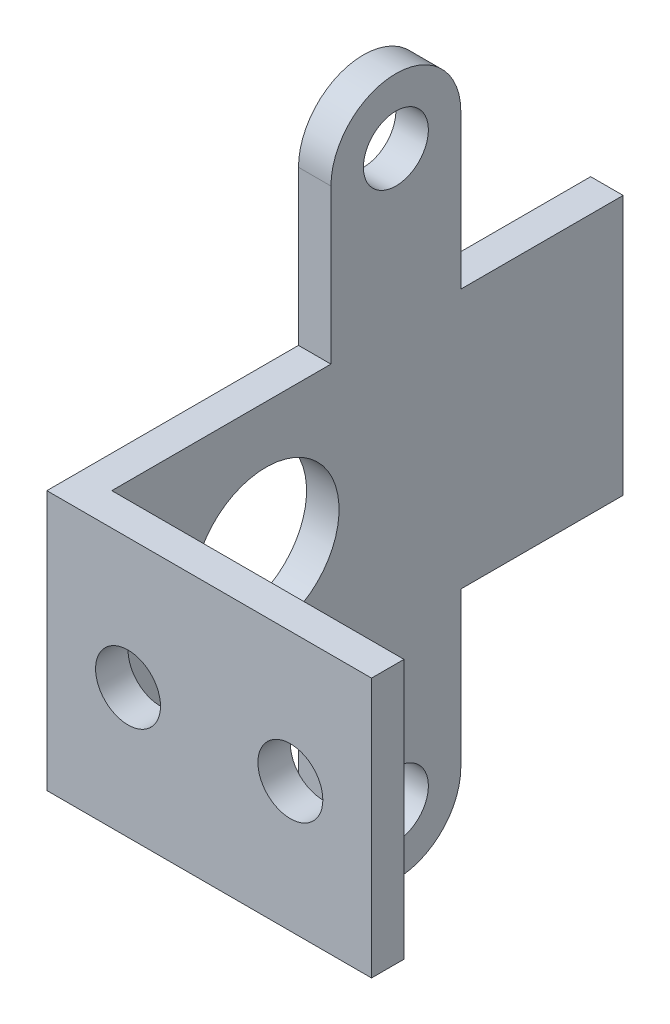
ISO-10303-21;
HEADER;
FILE_DESCRIPTION(('STEP AP214'),'2;1');
FILE_NAME('part.step','',(''),(''),'','','');
FILE_SCHEMA(('AUTOMOTIVE_DESIGN { 1 0 10303 214 1 1 1 1 }'));
ENDSEC;
DATA;
#1=APPLICATION_CONTEXT('core data for automotive mechanical design processes');
#2=APPLICATION_PROTOCOL_DEFINITION('international standard','automotive_design',2000,#1);
#3=PRODUCT_CONTEXT('',#1,'mechanical');
#4=PRODUCT('Part','Part','',(#3));
#5=PRODUCT_RELATED_PRODUCT_CATEGORY('part','',(#4));
#6=PRODUCT_DEFINITION_FORMATION('','',#4);
#7=PRODUCT_DEFINITION_CONTEXT('part definition',#1,'design');
#8=PRODUCT_DEFINITION('design','',#6,#7);
#9=PRODUCT_DEFINITION_SHAPE('','',#8);
#10=(LENGTH_UNIT() NAMED_UNIT(*) SI_UNIT(.MILLI.,.METRE.));
#11=(NAMED_UNIT(*) PLANE_ANGLE_UNIT() SI_UNIT($,.RADIAN.));
#12=(NAMED_UNIT(*) SI_UNIT($,.STERADIAN.) SOLID_ANGLE_UNIT());
#13=UNCERTAINTY_MEASURE_WITH_UNIT(LENGTH_MEASURE(1.E-05),#10,'distance_accuracy_value','');
#14=(GEOMETRIC_REPRESENTATION_CONTEXT(3) GLOBAL_UNCERTAINTY_ASSIGNED_CONTEXT((#13)) GLOBAL_UNIT_ASSIGNED_CONTEXT((#10,
#11,#12)) REPRESENTATION_CONTEXT('',''));
#15=CARTESIAN_POINT('',(0.,0.,0.));
#16=DIRECTION('',(0.,0.,1.));
#17=DIRECTION('',(1.,0.,0.));
#18=AXIS2_PLACEMENT_3D('',#15,#16,#17);
#19=CARTESIAN_POINT('',(0.,16.,0.));
#20=DIRECTION('',(0.,-1.,0.));
#21=DIRECTION('',(0.,0.,-1.));
#22=AXIS2_PLACEMENT_3D('',#19,#20,#21);
#23=PLANE('',#22);
#24=DIRECTION('',(-1.,0.,0.));
#25=VECTOR('',#24,1.);
#26=CARTESIAN_POINT('',(-2.62068965517241,16.,-16.));
#27=LINE('',#26,#25);
#28=CARTESIAN_POINT('',(-2.62068965517241,16.,-16.));
#29=VERTEX_POINT('',#28);
#30=CARTESIAN_POINT('',(-4.62068965517241,16.,-16.));
#31=VERTEX_POINT('',#30);
#32=EDGE_CURVE('E152',#29,#31,#27,.T.);
#33=ORIENTED_EDGE('',*,*,#32,.F.);
#34=DIRECTION('',(0.,0.,-1.));
#35=VECTOR('',#34,1.);
#36=CARTESIAN_POINT('',(-2.62068965517241,16.,-26.));
#37=LINE('',#36,#35);
#38=CARTESIAN_POINT('',(-2.62068965517241,16.,-26.));
#39=VERTEX_POINT('',#38);
#40=EDGE_CURVE('E166',#29,#39,#37,.T.);
#41=ORIENTED_EDGE('',*,*,#40,.T.);
#42=DIRECTION('',(-1.,0.,0.));
#43=VECTOR('',#42,1.);
#44=CARTESIAN_POINT('',(-4.62068965517241,16.,-26.));
#45=LINE('',#44,#43);
#46=CARTESIAN_POINT('',(-4.62068965517241,16.,-26.));
#47=VERTEX_POINT('',#46);
#48=EDGE_CURVE('E212',#39,#47,#45,.T.);
#49=ORIENTED_EDGE('',*,*,#48,.T.);
#50=DIRECTION('',(0.,0.,1.));
#51=VECTOR('',#50,1.);
#52=CARTESIAN_POINT('',(-4.62068965517241,16.,-26.));
#53=LINE('',#52,#51);
#54=EDGE_CURVE('E168',#47,#31,#53,.T.);
#55=ORIENTED_EDGE('',*,*,#54,.T.);
#56=EDGE_LOOP('',(#33,#41,#49,#55));
#57=FACE_BOUND('',#56,.T.);
#58=ADVANCED_FACE('F45',(#57),#23,.F.);
#59=CARTESIAN_POINT('',(0.,0.,0.));
#60=DIRECTION('',(0.,-1.,0.));
#61=DIRECTION('',(0.,0.,-1.));
#62=AXIS2_PLACEMENT_3D('',#59,#60,#61);
#63=PLANE('',#62);
#64=DIRECTION('',(0.,0.,-1.));
#65=VECTOR('',#64,1.);
#66=CARTESIAN_POINT('',(-2.62068965517241,0.,-26.));
#67=LINE('',#66,#65);
#68=CARTESIAN_POINT('',(-2.62068965517241,0.,-16.));
#69=VERTEX_POINT('',#68);
#70=CARTESIAN_POINT('',(-2.62068965517241,0.,-26.));
#71=VERTEX_POINT('',#70);
#72=EDGE_CURVE('E208',#69,#71,#67,.T.);
#73=ORIENTED_EDGE('',*,*,#72,.F.);
#74=DIRECTION('',(-1.,0.,0.));
#75=VECTOR('',#74,1.);
#76=CARTESIAN_POINT('',(-2.62068965517241,0.,-16.));
#77=LINE('',#76,#75);
#78=CARTESIAN_POINT('',(-4.62068965517241,0.,-16.));
#79=VERTEX_POINT('',#78);
#80=EDGE_CURVE('E342',#69,#79,#77,.T.);
#81=ORIENTED_EDGE('',*,*,#80,.T.);
#82=DIRECTION('',(0.,0.,1.));
#83=VECTOR('',#82,1.);
#84=CARTESIAN_POINT('',(-4.62068965517241,0.,-26.));
#85=LINE('',#84,#83);
#86=CARTESIAN_POINT('',(-4.62068965517241,0.,-26.));
#87=VERTEX_POINT('',#86);
#88=EDGE_CURVE('E195',#87,#79,#85,.T.);
#89=ORIENTED_EDGE('',*,*,#88,.F.);
#90=DIRECTION('',(-1.,0.,0.));
#91=VECTOR('',#90,1.);
#92=CARTESIAN_POINT('',(-4.62068965517241,0.,-26.));
#93=LINE('',#92,#91);
#94=EDGE_CURVE('E190',#71,#87,#93,.T.);
#95=ORIENTED_EDGE('',*,*,#94,.F.);
#96=EDGE_LOOP('',(#73,#81,#89,#95));
#97=FACE_BOUND('',#96,.T.);
#98=ADVANCED_FACE('F395',(#97),#63,.T.);
#99=CARTESIAN_POINT('',(-4.62068965517241,16.,-26.));
#100=DIRECTION('',(0.,0.,1.));
#101=DIRECTION('',(1.,0.,0.));
#102=AXIS2_PLACEMENT_3D('',#99,#100,#101);
#103=PLANE('',#102);
#104=ORIENTED_EDGE('',*,*,#94,.T.);
#105=DIRECTION('',(0.,-1.,0.));
#106=VECTOR('',#105,1.);
#107=CARTESIAN_POINT('',(-4.62068965517241,16.,-26.));
#108=LINE('',#107,#106);
#109=EDGE_CURVE('E11',#47,#87,#108,.T.);
#110=ORIENTED_EDGE('',*,*,#109,.F.);
#111=ORIENTED_EDGE('',*,*,#48,.F.);
#112=DIRECTION('',(0.,-1.,0.));
#113=VECTOR('',#112,1.);
#114=CARTESIAN_POINT('',(-2.62068965517241,16.,-26.));
#115=LINE('',#114,#113);
#116=EDGE_CURVE('E177',#39,#71,#115,.T.);
#117=ORIENTED_EDGE('',*,*,#116,.T.);
#118=EDGE_LOOP('',(#104,#110,#111,#117));
#119=FACE_BOUND('',#118,.T.);
#120=ADVANCED_FACE('F47',(#119),#103,.F.);
#121=CARTESIAN_POINT('',(-4.62068965517241,16.,-26.));
#122=DIRECTION('',(1.,0.,0.));
#123=DIRECTION('',(0.,0.,-1.));
#124=AXIS2_PLACEMENT_3D('',#121,#122,#123);
#125=PLANE('',#124);
#126=CARTESIAN_POINT('',(-4.62068965517241,8.,-4.00000000000001));
#127=DIRECTION('',(-1.,0.,0.));
#128=DIRECTION('',(0.,0.,1.));
#129=AXIS2_PLACEMENT_3D('',#126,#127,#128);
#130=CIRCLE('',#129,4.5);
#131=CARTESIAN_POINT('',(-4.62068965517241,8.,0.49999999999999));
#132=VERTEX_POINT('',#131);
#133=EDGE_CURVE('E370',#132,#132,#130,.T.);
#134=ORIENTED_EDGE('',*,*,#133,.F.);
#135=EDGE_LOOP('',(#134));
#136=FACE_BOUND('',#135,.T.);
#137=ORIENTED_EDGE('',*,*,#88,.T.);
#138=DIRECTION('',(0.,-1.,0.));
#139=VECTOR('',#138,1.);
#140=CARTESIAN_POINT('',(-4.62068965517241,0.,-16.));
#141=LINE('',#140,#139);
#142=CARTESIAN_POINT('',(-4.62068965517241,-9.5,-16.));
#143=VERTEX_POINT('',#142);
#144=EDGE_CURVE('E71',#79,#143,#141,.T.);
#145=ORIENTED_EDGE('',*,*,#144,.T.);
#146=CARTESIAN_POINT('',(-4.62068965517241,-9.5,-12.));
#147=DIRECTION('',(-1.,0.,0.));
#148=DIRECTION('',(0.,0.,1.));
#149=AXIS2_PLACEMENT_3D('',#146,#147,#148);
#150=CIRCLE('',#149,4.);
#151=CARTESIAN_POINT('',(-4.62068965517241,-9.5,-8.00000000000001));
#152=VERTEX_POINT('',#151);
#153=EDGE_CURVE('E336',#143,#152,#150,.T.);
#154=ORIENTED_EDGE('',*,*,#153,.T.);
#155=DIRECTION('',(0.,1.,0.));
#156=VECTOR('',#155,1.);
#157=CARTESIAN_POINT('',(-4.62068965517241,0.,-8.00000000000001));
#158=LINE('',#157,#156);
#159=CARTESIAN_POINT('',(-4.62068965517241,0.,-8.00000000000001));
#160=VERTEX_POINT('',#159);
#161=EDGE_CURVE('E293',#152,#160,#158,.T.);
#162=ORIENTED_EDGE('',*,*,#161,.T.);
#163=CARTESIAN_POINT('',(-4.62068965517241,0.,7.49999999999999));
#164=VERTEX_POINT('',#163);
#165=EDGE_CURVE('E194',#160,#164,#85,.T.);
#166=ORIENTED_EDGE('',*,*,#165,.T.);
#167=DIRECTION('',(0.,-1.,0.));
#168=VECTOR('',#167,1.);
#169=CARTESIAN_POINT('',(-4.62068965517241,16.,7.49999999999999));
#170=LINE('',#169,#168);
#171=CARTESIAN_POINT('',(-4.62068965517241,16.,7.49999999999999));
#172=VERTEX_POINT('',#171);
#173=EDGE_CURVE('E55',#172,#164,#170,.T.);
#174=ORIENTED_EDGE('',*,*,#173,.F.);
#175=CARTESIAN_POINT('',(-4.62068965517241,16.,-8.00000000000001));
#176=VERTEX_POINT('',#175);
#177=EDGE_CURVE('E252',#176,#172,#53,.T.);
#178=ORIENTED_EDGE('',*,*,#177,.F.);
#179=DIRECTION('',(0.,1.,0.));
#180=VECTOR('',#179,1.);
#181=CARTESIAN_POINT('',(-4.62068965517241,16.,-8.00000000000001));
#182=LINE('',#181,#180);
#183=CARTESIAN_POINT('',(-4.62068965517241,25.5,-8.00000000000001));
#184=VERTEX_POINT('',#183);
#185=EDGE_CURVE('E63',#176,#184,#182,.T.);
#186=ORIENTED_EDGE('',*,*,#185,.T.);
#187=CARTESIAN_POINT('',(-4.62068965517241,25.5,-12.));
#188=DIRECTION('',(-1.,0.,0.));
#189=DIRECTION('',(0.,0.,1.));
#190=AXIS2_PLACEMENT_3D('',#187,#188,#189);
#191=CIRCLE('',#190,4.);
#192=CARTESIAN_POINT('',(-4.62068965517241,25.5,-16.));
#193=VERTEX_POINT('',#192);
#194=EDGE_CURVE('E161',#184,#193,#191,.T.);
#195=ORIENTED_EDGE('',*,*,#194,.T.);
#196=DIRECTION('',(0.,-1.,0.));
#197=VECTOR('',#196,1.);
#198=CARTESIAN_POINT('',(-4.62068965517241,16.,-16.));
#199=LINE('',#198,#197);
#200=EDGE_CURVE('E360',#193,#31,#199,.T.);
#201=ORIENTED_EDGE('',*,*,#200,.T.);
#202=ORIENTED_EDGE('',*,*,#54,.F.);
#203=ORIENTED_EDGE('',*,*,#109,.T.);
#204=EDGE_LOOP('',(#137,#145,#154,#162,#166,#174,#178,#186,#195,#201,#202,#203));
#205=FACE_BOUND('',#204,.T.);
#206=CARTESIAN_POINT('',(-4.62068965517241,-9.5,-12.));
#207=DIRECTION('',(-1.,0.,0.));
#208=DIRECTION('',(0.,0.,1.));
#209=AXIS2_PLACEMENT_3D('',#206,#207,#208);
#210=CIRCLE('',#209,2.);
#211=CARTESIAN_POINT('',(-4.62068965517241,-9.5,-10.));
#212=VERTEX_POINT('',#211);
#213=EDGE_CURVE('E322',#212,#212,#210,.T.);
#214=ORIENTED_EDGE('',*,*,#213,.F.);
#215=EDGE_LOOP('',(#214));
#216=FACE_BOUND('',#215,.T.);
#217=CARTESIAN_POINT('',(-4.62068965517241,25.5,-12.));
#218=DIRECTION('',(-1.,0.,0.));
#219=DIRECTION('',(0.,0.,1.));
#220=AXIS2_PLACEMENT_3D('',#217,#218,#219);
#221=CIRCLE('',#220,2.);
#222=CARTESIAN_POINT('',(-4.62068965517241,25.5,-10.));
#223=VERTEX_POINT('',#222);
#224=EDGE_CURVE('E325',#223,#223,#221,.T.);
#225=ORIENTED_EDGE('',*,*,#224,.F.);
#226=EDGE_LOOP('',(#225));
#227=FACE_BOUND('',#226,.T.);
#228=ADVANCED_FACE('F282',(#136,#205,#216,#227),#125,.F.);
#229=CARTESIAN_POINT('',(-4.62068965517241,16.,7.49999999999999));
#230=DIRECTION('',(0.,0.,-1.));
#231=DIRECTION('',(-1.,0.,0.));
#232=AXIS2_PLACEMENT_3D('',#229,#230,#231);
#233=PLANE('',#232);
#234=CARTESIAN_POINT('',(0.379310344827589,8.,7.49999999999999));
#235=DIRECTION('',(0.,0.,1.));
#236=DIRECTION('',(1.,0.,0.));
#237=AXIS2_PLACEMENT_3D('',#234,#235,#236);
#238=CIRCLE('',#237,2.);
#239=CARTESIAN_POINT('',(2.37931034482759,8.,7.49999999999999));
#240=VERTEX_POINT('',#239);
#241=EDGE_CURVE('E232',#240,#240,#238,.T.);
#242=ORIENTED_EDGE('',*,*,#241,.F.);
#243=EDGE_LOOP('',(#242));
#244=FACE_BOUND('',#243,.T.);
#245=CARTESIAN_POINT('',(10.3793103448276,8.,7.49999999999999));
#246=DIRECTION('',(0.,0.,1.));
#247=DIRECTION('',(1.,0.,0.));
#248=AXIS2_PLACEMENT_3D('',#245,#246,#247);
#249=CIRCLE('',#248,2.);
#250=CARTESIAN_POINT('',(12.3793103448276,8.,7.49999999999999));
#251=VERTEX_POINT('',#250);
#252=EDGE_CURVE('E239',#251,#251,#249,.T.);
#253=ORIENTED_EDGE('',*,*,#252,.F.);
#254=EDGE_LOOP('',(#253));
#255=FACE_BOUND('',#254,.T.);
#256=DIRECTION('',(1.,0.,0.));
#257=VECTOR('',#256,1.);
#258=CARTESIAN_POINT('',(-4.62068965517241,0.,7.49999999999999));
#259=LINE('',#258,#257);
#260=CARTESIAN_POINT('',(15.3793103448276,0.,7.49999999999999));
#261=VERTEX_POINT('',#260);
#262=EDGE_CURVE('E199',#164,#261,#259,.T.);
#263=ORIENTED_EDGE('',*,*,#262,.T.);
#264=DIRECTION('',(0.,-1.,0.));
#265=VECTOR('',#264,1.);
#266=CARTESIAN_POINT('',(15.3793103448276,16.,7.49999999999999));
#267=LINE('',#266,#265);
#268=CARTESIAN_POINT('',(15.3793103448276,16.,7.49999999999999));
#269=VERTEX_POINT('',#268);
#270=EDGE_CURVE('E223',#269,#261,#267,.T.);
#271=ORIENTED_EDGE('',*,*,#270,.F.);
#272=DIRECTION('',(1.,0.,0.));
#273=VECTOR('',#272,1.);
#274=CARTESIAN_POINT('',(-4.62068965517241,16.,7.49999999999999));
#275=LINE('',#274,#273);
#276=EDGE_CURVE('E255',#172,#269,#275,.T.);
#277=ORIENTED_EDGE('',*,*,#276,.F.);
#278=ORIENTED_EDGE('',*,*,#173,.T.);
#279=EDGE_LOOP('',(#263,#271,#277,#278));
#280=FACE_BOUND('',#279,.T.);
#281=ADVANCED_FACE('F298',(#244,#255,#280),#233,.F.);
#282=CARTESIAN_POINT('',(15.3793103448276,16.,5.49999999999999));
#283=DIRECTION('',(-1.,0.,0.));
#284=DIRECTION('',(0.,0.,1.));
#285=AXIS2_PLACEMENT_3D('',#282,#283,#284);
#286=PLANE('',#285);
#287=DIRECTION('',(0.,0.,-1.));
#288=VECTOR('',#287,1.);
#289=CARTESIAN_POINT('',(15.3793103448276,0.,5.49999999999999));
#290=LINE('',#289,#288);
#291=CARTESIAN_POINT('',(15.3793103448276,0.,5.49999999999999));
#292=VERTEX_POINT('',#291);
#293=EDGE_CURVE('E202',#261,#292,#290,.T.);
#294=ORIENTED_EDGE('',*,*,#293,.T.);
#295=DIRECTION('',(0.,-1.,0.));
#296=VECTOR('',#295,1.);
#297=CARTESIAN_POINT('',(15.3793103448276,16.,5.49999999999999));
#298=LINE('',#297,#296);
#299=CARTESIAN_POINT('',(15.3793103448276,16.,5.49999999999999));
#300=VERTEX_POINT('',#299);
#301=EDGE_CURVE('E219',#300,#292,#298,.T.);
#302=ORIENTED_EDGE('',*,*,#301,.F.);
#303=DIRECTION('',(0.,0.,-1.));
#304=VECTOR('',#303,1.);
#305=CARTESIAN_POINT('',(15.3793103448276,16.,5.49999999999999));
#306=LINE('',#305,#304);
#307=EDGE_CURVE('E186',#269,#300,#306,.T.);
#308=ORIENTED_EDGE('',*,*,#307,.F.);
#309=ORIENTED_EDGE('',*,*,#270,.T.);
#310=EDGE_LOOP('',(#294,#302,#308,#309));
#311=FACE_BOUND('',#310,.T.);
#312=ADVANCED_FACE('F267',(#311),#286,.F.);
#313=CARTESIAN_POINT('',(-2.62068965517241,16.,5.49999999999999));
#314=DIRECTION('',(0.,0.,1.));
#315=DIRECTION('',(1.,0.,0.));
#316=AXIS2_PLACEMENT_3D('',#313,#314,#315);
#317=PLANE('',#316);
#318=CARTESIAN_POINT('',(0.379310344827589,8.,5.49999999999999));
#319=DIRECTION('',(0.,0.,1.));
#320=DIRECTION('',(1.,0.,0.));
#321=AXIS2_PLACEMENT_3D('',#318,#319,#320);
#322=CIRCLE('',#321,2.);
#323=CARTESIAN_POINT('',(2.37931034482759,8.,5.49999999999999));
#324=VERTEX_POINT('',#323);
#325=EDGE_CURVE('E49',#324,#324,#322,.T.);
#326=ORIENTED_EDGE('',*,*,#325,.T.);
#327=EDGE_LOOP('',(#326));
#328=FACE_BOUND('',#327,.T.);
#329=CARTESIAN_POINT('',(10.3793103448276,8.,5.49999999999999));
#330=DIRECTION('',(0.,0.,1.));
#331=DIRECTION('',(1.,0.,0.));
#332=AXIS2_PLACEMENT_3D('',#329,#330,#331);
#333=CIRCLE('',#332,2.);
#334=CARTESIAN_POINT('',(12.3793103448276,8.,5.49999999999999));
#335=VERTEX_POINT('',#334);
#336=EDGE_CURVE('E229',#335,#335,#333,.T.);
#337=ORIENTED_EDGE('',*,*,#336,.T.);
#338=EDGE_LOOP('',(#337));
#339=FACE_BOUND('',#338,.T.);
#340=DIRECTION('',(-1.,0.,0.));
#341=VECTOR('',#340,1.);
#342=CARTESIAN_POINT('',(-2.62068965517241,0.,5.49999999999999));
#343=LINE('',#342,#341);
#344=CARTESIAN_POINT('',(-2.62068965517241,0.,5.49999999999999));
#345=VERTEX_POINT('',#344);
#346=EDGE_CURVE('E205',#292,#345,#343,.T.);
#347=ORIENTED_EDGE('',*,*,#346,.T.);
#348=DIRECTION('',(0.,-1.,0.));
#349=VECTOR('',#348,1.);
#350=CARTESIAN_POINT('',(-2.62068965517241,16.,5.49999999999999));
#351=LINE('',#350,#349);
#352=CARTESIAN_POINT('',(-2.62068965517241,16.,5.49999999999999));
#353=VERTEX_POINT('',#352);
#354=EDGE_CURVE('E215',#353,#345,#351,.T.);
#355=ORIENTED_EDGE('',*,*,#354,.F.);
#356=DIRECTION('',(-1.,0.,0.));
#357=VECTOR('',#356,1.);
#358=CARTESIAN_POINT('',(-2.62068965517241,16.,5.49999999999999));
#359=LINE('',#358,#357);
#360=EDGE_CURVE('E181',#300,#353,#359,.T.);
#361=ORIENTED_EDGE('',*,*,#360,.F.);
#362=ORIENTED_EDGE('',*,*,#301,.T.);
#363=EDGE_LOOP('',(#347,#355,#361,#362));
#364=FACE_BOUND('',#363,.T.);
#365=ADVANCED_FACE('F271',(#328,#339,#364),#317,.F.);
#366=CARTESIAN_POINT('',(-2.62068965517241,16.,-26.));
#367=DIRECTION('',(-1.,0.,0.));
#368=DIRECTION('',(0.,0.,1.));
#369=AXIS2_PLACEMENT_3D('',#366,#367,#368);
#370=PLANE('',#369);
#371=CARTESIAN_POINT('',(-2.62068965517241,8.,-4.00000000000001));
#372=DIRECTION('',(-1.,0.,0.));
#373=DIRECTION('',(0.,0.,1.));
#374=AXIS2_PLACEMENT_3D('',#371,#372,#373);
#375=CIRCLE('',#374,4.5);
#376=CARTESIAN_POINT('',(-2.62068965517241,8.,0.49999999999999));
#377=VERTEX_POINT('',#376);
#378=EDGE_CURVE('E345',#377,#377,#375,.T.);
#379=ORIENTED_EDGE('',*,*,#378,.T.);
#380=EDGE_LOOP('',(#379));
#381=FACE_BOUND('',#380,.T.);
#382=CARTESIAN_POINT('',(-2.62068965517241,0.,-8.00000000000001));
#383=VERTEX_POINT('',#382);
#384=EDGE_CURVE('E209',#345,#383,#67,.T.);
#385=ORIENTED_EDGE('',*,*,#384,.T.);
#386=DIRECTION('',(0.,1.,0.));
#387=VECTOR('',#386,1.);
#388=CARTESIAN_POINT('',(-2.62068965517241,0.,-8.00000000000001));
#389=LINE('',#388,#387);
#390=CARTESIAN_POINT('',(-2.62068965517241,-9.5,-8.00000000000001));
#391=VERTEX_POINT('',#390);
#392=EDGE_CURVE('E303',#391,#383,#389,.T.);
#393=ORIENTED_EDGE('',*,*,#392,.F.);
#394=CARTESIAN_POINT('',(-2.62068965517241,-9.5,-12.));
#395=DIRECTION('',(-1.,0.,0.));
#396=DIRECTION('',(0.,0.,1.));
#397=AXIS2_PLACEMENT_3D('',#394,#395,#396);
#398=CIRCLE('',#397,4.);
#399=CARTESIAN_POINT('',(-2.62068965517241,-9.5,-16.));
#400=VERTEX_POINT('',#399);
#401=EDGE_CURVE('E306',#400,#391,#398,.T.);
#402=ORIENTED_EDGE('',*,*,#401,.F.);
#403=DIRECTION('',(0.,-1.,0.));
#404=VECTOR('',#403,1.);
#405=CARTESIAN_POINT('',(-2.62068965517241,0.,-16.));
#406=LINE('',#405,#404);
#407=EDGE_CURVE('E317',#69,#400,#406,.T.);
#408=ORIENTED_EDGE('',*,*,#407,.F.);
#409=ORIENTED_EDGE('',*,*,#72,.T.);
#410=ORIENTED_EDGE('',*,*,#116,.F.);
#411=ORIENTED_EDGE('',*,*,#40,.F.);
#412=DIRECTION('',(0.,-1.,0.));
#413=VECTOR('',#412,1.);
#414=CARTESIAN_POINT('',(-2.62068965517241,16.,-16.));
#415=LINE('',#414,#413);
#416=CARTESIAN_POINT('',(-2.62068965517241,25.5,-16.));
#417=VERTEX_POINT('',#416);
#418=EDGE_CURVE('E148',#417,#29,#415,.T.);
#419=ORIENTED_EDGE('',*,*,#418,.F.);
#420=CARTESIAN_POINT('',(-2.62068965517241,25.5,-12.));
#421=DIRECTION('',(-1.,0.,0.));
#422=DIRECTION('',(0.,0.,1.));
#423=AXIS2_PLACEMENT_3D('',#420,#421,#422);
#424=CIRCLE('',#423,4.);
#425=CARTESIAN_POINT('',(-2.62068965517241,25.5,-8.00000000000001));
#426=VERTEX_POINT('',#425);
#427=EDGE_CURVE('E171',#426,#417,#424,.T.);
#428=ORIENTED_EDGE('',*,*,#427,.F.);
#429=DIRECTION('',(0.,1.,0.));
#430=VECTOR('',#429,1.);
#431=CARTESIAN_POINT('',(-2.62068965517241,16.,-8.00000000000001));
#432=LINE('',#431,#430);
#433=CARTESIAN_POINT('',(-2.62068965517241,16.,-8.00000000000001));
#434=VERTEX_POINT('',#433);
#435=EDGE_CURVE('E160',#434,#426,#432,.T.);
#436=ORIENTED_EDGE('',*,*,#435,.F.);
#437=EDGE_CURVE('E180',#353,#434,#37,.T.);
#438=ORIENTED_EDGE('',*,*,#437,.F.);
#439=ORIENTED_EDGE('',*,*,#354,.T.);
#440=EDGE_LOOP('',(#385,#393,#402,#408,#409,#410,#411,#419,#428,#436,#438,#439));
#441=FACE_BOUND('',#440,.T.);
#442=CARTESIAN_POINT('',(-2.62068965517241,-9.5,-12.));
#443=DIRECTION('',(-1.,0.,0.));
#444=DIRECTION('',(0.,0.,1.));
#445=AXIS2_PLACEMENT_3D('',#442,#443,#444);
#446=CIRCLE('',#445,2.);
#447=CARTESIAN_POINT('',(-2.62068965517241,-9.5,-10.));
#448=VERTEX_POINT('',#447);
#449=EDGE_CURVE('E247',#448,#448,#446,.T.);
#450=ORIENTED_EDGE('',*,*,#449,.T.);
#451=EDGE_LOOP('',(#450));
#452=FACE_BOUND('',#451,.T.);
#453=CARTESIAN_POINT('',(-2.62068965517241,25.5,-12.));
#454=DIRECTION('',(-1.,0.,0.));
#455=DIRECTION('',(0.,0.,1.));
#456=AXIS2_PLACEMENT_3D('',#453,#454,#455);
#457=CIRCLE('',#456,2.);
#458=CARTESIAN_POINT('',(-2.62068965517241,25.5,-10.));
#459=VERTEX_POINT('',#458);
#460=EDGE_CURVE('E331',#459,#459,#457,.T.);
#461=ORIENTED_EDGE('',*,*,#460,.T.);
#462=EDGE_LOOP('',(#461));
#463=FACE_BOUND('',#462,.T.);
#464=ADVANCED_FACE('F174',(#381,#441,#452,#463),#370,.F.);
#465=ORIENTED_EDGE('',*,*,#437,.T.);
#466=DIRECTION('',(-1.,0.,0.));
#467=VECTOR('',#466,1.);
#468=CARTESIAN_POINT('',(-2.62068965517241,16.,-8.00000000000001));
#469=LINE('',#468,#467);
#470=EDGE_CURVE('E170',#434,#176,#469,.T.);
#471=ORIENTED_EDGE('',*,*,#470,.T.);
#472=ORIENTED_EDGE('',*,*,#177,.T.);
#473=ORIENTED_EDGE('',*,*,#276,.T.);
#474=ORIENTED_EDGE('',*,*,#307,.T.);
#475=ORIENTED_EDGE('',*,*,#360,.T.);
#476=EDGE_LOOP('',(#465,#471,#472,#473,#474,#475));
#477=FACE_BOUND('',#476,.T.);
#478=ADVANCED_FACE('F261',(#477),#23,.F.);
#479=DIRECTION('',(-1.,0.,0.));
#480=VECTOR('',#479,1.);
#481=CARTESIAN_POINT('',(-2.62068965517241,0.,-8.00000000000001));
#482=LINE('',#481,#480);
#483=EDGE_CURVE('E300',#383,#160,#482,.T.);
#484=ORIENTED_EDGE('',*,*,#483,.F.);
#485=ORIENTED_EDGE('',*,*,#384,.F.);
#486=ORIENTED_EDGE('',*,*,#346,.F.);
#487=ORIENTED_EDGE('',*,*,#293,.F.);
#488=ORIENTED_EDGE('',*,*,#262,.F.);
#489=ORIENTED_EDGE('',*,*,#165,.F.);
#490=EDGE_LOOP('',(#484,#485,#486,#487,#488,#489));
#491=FACE_BOUND('',#490,.T.);
#492=ADVANCED_FACE('F299',(#491),#63,.T.);
#493=CARTESIAN_POINT('',(10.3793103448276,8.,-8.50000000000001));
#494=DIRECTION('',(0.,0.,1.));
#495=DIRECTION('',(1.,0.,0.));
#496=AXIS2_PLACEMENT_3D('',#493,#494,#495);
#497=CYLINDRICAL_SURFACE('',#496,2.);
#498=ORIENTED_EDGE('',*,*,#252,.T.);
#499=EDGE_LOOP('',(#498));
#500=FACE_BOUND('',#499,.T.);
#501=ORIENTED_EDGE('',*,*,#336,.F.);
#502=EDGE_LOOP('',(#501));
#503=FACE_BOUND('',#502,.T.);
#504=ADVANCED_FACE('F410',(#500,#503),#497,.F.);
#505=CARTESIAN_POINT('',(0.379310344827589,8.,-8.50000000000001));
#506=DIRECTION('',(0.,0.,1.));
#507=DIRECTION('',(1.,0.,0.));
#508=AXIS2_PLACEMENT_3D('',#505,#506,#507);
#509=CYLINDRICAL_SURFACE('',#508,2.);
#510=ORIENTED_EDGE('',*,*,#241,.T.);
#511=EDGE_LOOP('',(#510));
#512=FACE_BOUND('',#511,.T.);
#513=ORIENTED_EDGE('',*,*,#325,.F.);
#514=EDGE_LOOP('',(#513));
#515=FACE_BOUND('',#514,.T.);
#516=ADVANCED_FACE('F441',(#512,#515),#509,.F.);
#517=CARTESIAN_POINT('',(-2.62068965517241,0.,-16.));
#518=DIRECTION('',(0.,0.,-1.));
#519=DIRECTION('',(0.,1.,0.));
#520=AXIS2_PLACEMENT_3D('',#517,#518,#519);
#521=PLANE('',#520);
#522=ORIENTED_EDGE('',*,*,#144,.F.);
#523=ORIENTED_EDGE('',*,*,#80,.F.);
#524=ORIENTED_EDGE('',*,*,#407,.T.);
#525=DIRECTION('',(-1.,0.,0.));
#526=VECTOR('',#525,1.);
#527=CARTESIAN_POINT('',(-2.62068965517241,-9.5,-16.));
#528=LINE('',#527,#526);
#529=EDGE_CURVE('E310',#400,#143,#528,.T.);
#530=ORIENTED_EDGE('',*,*,#529,.T.);
#531=EDGE_LOOP('',(#522,#523,#524,#530));
#532=FACE_BOUND('',#531,.T.);
#533=ADVANCED_FACE('F449',(#532),#521,.T.);
#534=CARTESIAN_POINT('',(-2.62068965517241,0.,-8.00000000000001));
#535=DIRECTION('',(0.,0.,1.));
#536=DIRECTION('',(0.,-1.,0.));
#537=AXIS2_PLACEMENT_3D('',#534,#535,#536);
#538=PLANE('',#537);
#539=ORIENTED_EDGE('',*,*,#161,.F.);
#540=DIRECTION('',(-1.,0.,0.));
#541=VECTOR('',#540,1.);
#542=CARTESIAN_POINT('',(-2.62068965517241,-9.5,-8.00000000000001));
#543=LINE('',#542,#541);
#544=EDGE_CURVE('E315',#391,#152,#543,.T.);
#545=ORIENTED_EDGE('',*,*,#544,.F.);
#546=ORIENTED_EDGE('',*,*,#392,.T.);
#547=ORIENTED_EDGE('',*,*,#483,.T.);
#548=EDGE_LOOP('',(#539,#545,#546,#547));
#549=FACE_BOUND('',#548,.T.);
#550=ADVANCED_FACE('F486',(#549),#538,.T.);
#551=CARTESIAN_POINT('',(-2.62068965517241,-9.5,-12.));
#552=DIRECTION('',(-1.,0.,0.));
#553=DIRECTION('',(0.,0.,1.));
#554=AXIS2_PLACEMENT_3D('',#551,#552,#553);
#555=CYLINDRICAL_SURFACE('',#554,4.);
#556=ORIENTED_EDGE('',*,*,#153,.F.);
#557=ORIENTED_EDGE('',*,*,#529,.F.);
#558=ORIENTED_EDGE('',*,*,#401,.T.);
#559=ORIENTED_EDGE('',*,*,#544,.T.);
#560=EDGE_LOOP('',(#556,#557,#558,#559));
#561=FACE_BOUND('',#560,.T.);
#562=ADVANCED_FACE('F314',(#561),#555,.T.);
#563=CARTESIAN_POINT('',(-2.62068965517241,-9.5,-12.));
#564=DIRECTION('',(-1.,0.,0.));
#565=DIRECTION('',(0.,0.,1.));
#566=AXIS2_PLACEMENT_3D('',#563,#564,#565);
#567=CYLINDRICAL_SURFACE('',#566,2.);
#568=ORIENTED_EDGE('',*,*,#449,.F.);
#569=EDGE_LOOP('',(#568));
#570=FACE_BOUND('',#569,.T.);
#571=ORIENTED_EDGE('',*,*,#213,.T.);
#572=EDGE_LOOP('',(#571));
#573=FACE_BOUND('',#572,.T.);
#574=ADVANCED_FACE('F503',(#570,#573),#567,.F.);
#575=CARTESIAN_POINT('',(-2.62068965517241,16.,-16.));
#576=DIRECTION('',(0.,0.,-1.));
#577=DIRECTION('',(0.,1.,0.));
#578=AXIS2_PLACEMENT_3D('',#575,#576,#577);
#579=PLANE('',#578);
#580=ORIENTED_EDGE('',*,*,#200,.F.);
#581=DIRECTION('',(-1.,0.,0.));
#582=VECTOR('',#581,1.);
#583=CARTESIAN_POINT('',(-2.62068965517241,25.5,-16.));
#584=LINE('',#583,#582);
#585=EDGE_CURVE('E154',#417,#193,#584,.T.);
#586=ORIENTED_EDGE('',*,*,#585,.F.);
#587=ORIENTED_EDGE('',*,*,#418,.T.);
#588=ORIENTED_EDGE('',*,*,#32,.T.);
#589=EDGE_LOOP('',(#580,#586,#587,#588));
#590=FACE_BOUND('',#589,.T.);
#591=ADVANCED_FACE('F151',(#590),#579,.T.);
#592=CARTESIAN_POINT('',(-2.62068965517241,25.5,-12.));
#593=DIRECTION('',(-1.,0.,0.));
#594=DIRECTION('',(0.,0.,1.));
#595=AXIS2_PLACEMENT_3D('',#592,#593,#594);
#596=CYLINDRICAL_SURFACE('',#595,4.);
#597=ORIENTED_EDGE('',*,*,#194,.F.);
#598=DIRECTION('',(-1.,0.,0.));
#599=VECTOR('',#598,1.);
#600=CARTESIAN_POINT('',(-2.62068965517241,25.5,-8.00000000000001));
#601=LINE('',#600,#599);
#602=EDGE_CURVE('E279',#426,#184,#601,.T.);
#603=ORIENTED_EDGE('',*,*,#602,.F.);
#604=ORIENTED_EDGE('',*,*,#427,.T.);
#605=ORIENTED_EDGE('',*,*,#585,.T.);
#606=EDGE_LOOP('',(#597,#603,#604,#605));
#607=FACE_BOUND('',#606,.T.);
#608=ADVANCED_FACE('F521',(#607),#596,.T.);
#609=CARTESIAN_POINT('',(-2.62068965517241,16.,-8.00000000000001));
#610=DIRECTION('',(0.,0.,1.));
#611=DIRECTION('',(1.,0.,0.));
#612=AXIS2_PLACEMENT_3D('',#609,#610,#611);
#613=PLANE('',#612);
#614=ORIENTED_EDGE('',*,*,#185,.F.);
#615=ORIENTED_EDGE('',*,*,#470,.F.);
#616=ORIENTED_EDGE('',*,*,#435,.T.);
#617=ORIENTED_EDGE('',*,*,#602,.T.);
#618=EDGE_LOOP('',(#614,#615,#616,#617));
#619=FACE_BOUND('',#618,.T.);
#620=ADVANCED_FACE('F530',(#619),#613,.T.);
#621=CARTESIAN_POINT('',(-2.62068965517241,25.5,-12.));
#622=DIRECTION('',(-1.,0.,0.));
#623=DIRECTION('',(0.,0.,1.));
#624=AXIS2_PLACEMENT_3D('',#621,#622,#623);
#625=CYLINDRICAL_SURFACE('',#624,2.);
#626=ORIENTED_EDGE('',*,*,#460,.F.);
#627=EDGE_LOOP('',(#626));
#628=FACE_BOUND('',#627,.T.);
#629=ORIENTED_EDGE('',*,*,#224,.T.);
#630=EDGE_LOOP('',(#629));
#631=FACE_BOUND('',#630,.T.);
#632=ADVANCED_FACE('F382',(#628,#631),#625,.F.);
#633=CARTESIAN_POINT('',(-2.62068965517241,8.,-4.00000000000001));
#634=DIRECTION('',(-1.,0.,0.));
#635=DIRECTION('',(0.,0.,1.));
#636=AXIS2_PLACEMENT_3D('',#633,#634,#635);
#637=CYLINDRICAL_SURFACE('',#636,4.5);
#638=ORIENTED_EDGE('',*,*,#378,.F.);
#639=EDGE_LOOP('',(#638));
#640=FACE_BOUND('',#639,.T.);
#641=ORIENTED_EDGE('',*,*,#133,.T.);
#642=EDGE_LOOP('',(#641));
#643=FACE_BOUND('',#642,.T.);
#644=ADVANCED_FACE('F379',(#640,#643),#637,.F.);
#645=CLOSED_SHELL('',(#58,#98,#120,#228,#281,#312,#365,#464,#478,#492,#504,#516,#533,#550,#562,
#574,#591,#608,#620,#632,#644));
#646=MANIFOLD_SOLID_BREP('B2',#645);
#647=ADVANCED_BREP_SHAPE_REPRESENTATION('',(#18,#646),#14);
#648=SHAPE_DEFINITION_REPRESENTATION(#9,#647);
ENDSEC;
END-ISO-10303-21;
